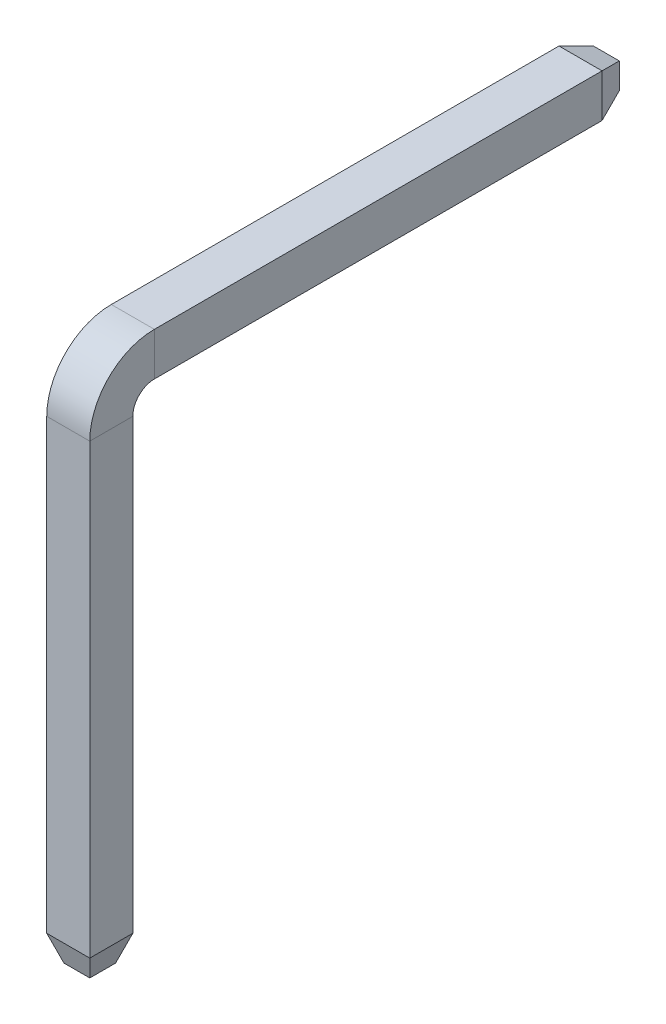
ISO-10303-21;
HEADER;
FILE_DESCRIPTION(('STEP AP214'),'2;1');
FILE_NAME('part.step','',(''),(''),'','','');
FILE_SCHEMA(('AUTOMOTIVE_DESIGN { 1 0 10303 214 1 1 1 1 }'));
ENDSEC;
DATA;
#1=APPLICATION_CONTEXT('core data for automotive mechanical design processes');
#2=APPLICATION_PROTOCOL_DEFINITION('international standard','automotive_design',2000,#1);
#3=PRODUCT_CONTEXT('',#1,'mechanical');
#4=PRODUCT('Part','Part','',(#3));
#5=PRODUCT_RELATED_PRODUCT_CATEGORY('part','',(#4));
#6=PRODUCT_DEFINITION_FORMATION('','',#4);
#7=PRODUCT_DEFINITION_CONTEXT('part definition',#1,'design');
#8=PRODUCT_DEFINITION('design','',#6,#7);
#9=PRODUCT_DEFINITION_SHAPE('','',#8);
#10=(LENGTH_UNIT() NAMED_UNIT(*) SI_UNIT(.MILLI.,.METRE.));
#11=(NAMED_UNIT(*) PLANE_ANGLE_UNIT() SI_UNIT($,.RADIAN.));
#12=(NAMED_UNIT(*) SI_UNIT($,.STERADIAN.) SOLID_ANGLE_UNIT());
#13=UNCERTAINTY_MEASURE_WITH_UNIT(LENGTH_MEASURE(1.E-05),#10,'distance_accuracy_value','');
#14=(GEOMETRIC_REPRESENTATION_CONTEXT(3) GLOBAL_UNCERTAINTY_ASSIGNED_CONTEXT((#13)) GLOBAL_UNIT_ASSIGNED_CONTEXT((#10,
#11,#12)) REPRESENTATION_CONTEXT('',''));
#15=CARTESIAN_POINT('',(0.,0.,0.));
#16=DIRECTION('',(0.,0.,1.));
#17=DIRECTION('',(1.,0.,0.));
#18=AXIS2_PLACEMENT_3D('',#15,#16,#17);
#19=CARTESIAN_POINT('',(0.,0.,0.));
#20=DIRECTION('',(0.,0.,-1.));
#21=DIRECTION('',(-1.,0.,0.));
#22=AXIS2_PLACEMENT_3D('',#19,#20,#21);
#23=PLANE('',#22);
#24=DIRECTION('',(0.,1.,0.));
#25=VECTOR('',#24,1.);
#26=CARTESIAN_POINT('',(-0.150000000000001,0.,0.));
#27=LINE('',#26,#25);
#28=CARTESIAN_POINT('',(-0.150000000000001,-0.150000000000001,0.));
#29=VERTEX_POINT('',#28);
#30=CARTESIAN_POINT('',(-0.150000000000001,0.150000000000001,0.));
#31=VERTEX_POINT('',#30);
#32=EDGE_CURVE('E236',#29,#31,#27,.T.);
#33=ORIENTED_EDGE('',*,*,#32,.T.);
#34=DIRECTION('',(1.,0.,0.));
#35=VECTOR('',#34,1.);
#36=CARTESIAN_POINT('',(0.,0.150000000000001,0.));
#37=LINE('',#36,#35);
#38=CARTESIAN_POINT('',(0.150000000000001,0.150000000000001,0.));
#39=VERTEX_POINT('',#38);
#40=EDGE_CURVE('E239',#31,#39,#37,.T.);
#41=ORIENTED_EDGE('',*,*,#40,.T.);
#42=DIRECTION('',(0.,-1.,0.));
#43=VECTOR('',#42,1.);
#44=CARTESIAN_POINT('',(0.150000000000001,0.,0.));
#45=LINE('',#44,#43);
#46=CARTESIAN_POINT('',(0.150000000000001,-0.150000000000001,0.));
#47=VERTEX_POINT('',#46);
#48=EDGE_CURVE('E230',#39,#47,#45,.T.);
#49=ORIENTED_EDGE('',*,*,#48,.T.);
#50=DIRECTION('',(-1.,0.,0.));
#51=VECTOR('',#50,1.);
#52=CARTESIAN_POINT('',(0.,-0.150000000000001,0.));
#53=LINE('',#52,#51);
#54=EDGE_CURVE('E233',#47,#29,#53,.T.);
#55=ORIENTED_EDGE('',*,*,#54,.T.);
#56=EDGE_LOOP('',(#33,#41,#49,#55));
#57=FACE_BOUND('',#56,.T.);
#58=ADVANCED_FACE('F41',(#57),#23,.T.);
#59=CARTESIAN_POINT('',(0.,-6.,6.));
#60=DIRECTION('',(0.,1.,0.));
#61=DIRECTION('',(-1.,0.,0.));
#62=AXIS2_PLACEMENT_3D('',#59,#60,#61);
#63=PLANE('',#62);
#64=DIRECTION('',(0.,0.,-1.));
#65=VECTOR('',#64,1.);
#66=CARTESIAN_POINT('',(-0.150000000000001,-6.,5.75));
#67=LINE('',#66,#65);
#68=CARTESIAN_POINT('',(-0.150000000000001,-6.,6.15));
#69=VERTEX_POINT('',#68);
#70=CARTESIAN_POINT('',(-0.150000000000001,-6.,5.85));
#71=VERTEX_POINT('',#70);
#72=EDGE_CURVE('E270',#69,#71,#67,.T.);
#73=ORIENTED_EDGE('',*,*,#72,.T.);
#74=DIRECTION('',(1.,0.,0.));
#75=VECTOR('',#74,1.);
#76=CARTESIAN_POINT('',(0.25,-6.,5.85));
#77=LINE('',#76,#75);
#78=CARTESIAN_POINT('',(0.150000000000001,-6.,5.85));
#79=VERTEX_POINT('',#78);
#80=EDGE_CURVE('E273',#71,#79,#77,.T.);
#81=ORIENTED_EDGE('',*,*,#80,.T.);
#82=DIRECTION('',(0.,0.,1.));
#83=VECTOR('',#82,1.);
#84=CARTESIAN_POINT('',(0.150000000000001,-6.,6.25));
#85=LINE('',#84,#83);
#86=CARTESIAN_POINT('',(0.150000000000001,-6.,6.15));
#87=VERTEX_POINT('',#86);
#88=EDGE_CURVE('E251',#79,#87,#85,.T.);
#89=ORIENTED_EDGE('',*,*,#88,.T.);
#90=DIRECTION('',(-1.,0.,0.));
#91=VECTOR('',#90,1.);
#92=CARTESIAN_POINT('',(-0.25,-6.,6.15));
#93=LINE('',#92,#91);
#94=EDGE_CURVE('E267',#87,#69,#93,.T.);
#95=ORIENTED_EDGE('',*,*,#94,.T.);
#96=EDGE_LOOP('',(#73,#81,#89,#95));
#97=FACE_BOUND('',#96,.T.);
#98=ADVANCED_FACE('F317',(#97),#63,.F.);
#99=CARTESIAN_POINT('',(0.25,-0.25,0.));
#100=DIRECTION('',(1.,0.,0.));
#101=DIRECTION('',(0.,0.,-1.));
#102=AXIS2_PLACEMENT_3D('',#99,#100,#101);
#103=PLANE('',#102);
#104=DIRECTION('',(0.,0.,1.));
#105=VECTOR('',#104,1.);
#106=CARTESIAN_POINT('',(0.25,-0.25,0.));
#107=LINE('',#106,#105);
#108=CARTESIAN_POINT('',(0.25,-0.25,0.300000000000002));
#109=VERTEX_POINT('',#108);
#110=CARTESIAN_POINT('',(0.25,-0.250000000000001,5.5));
#111=VERTEX_POINT('',#110);
#112=EDGE_CURVE('E133',#109,#111,#107,.T.);
#113=ORIENTED_EDGE('',*,*,#112,.F.);
#114=DIRECTION('',(0.,1.,0.));
#115=VECTOR('',#114,1.);
#116=CARTESIAN_POINT('',(0.25,-0.25,0.300000000000002));
#117=LINE('',#116,#115);
#118=CARTESIAN_POINT('',(0.25,0.25,0.300000000000002));
#119=VERTEX_POINT('',#118);
#120=EDGE_CURVE('E248',#109,#119,#117,.T.);
#121=ORIENTED_EDGE('',*,*,#120,.T.);
#122=DIRECTION('',(0.,0.,1.));
#123=VECTOR('',#122,1.);
#124=CARTESIAN_POINT('',(0.25,0.25,0.));
#125=LINE('',#124,#123);
#126=CARTESIAN_POINT('',(0.25,0.249999999999999,5.5));
#127=VERTEX_POINT('',#126);
#128=EDGE_CURVE('E171',#119,#127,#125,.T.);
#129=ORIENTED_EDGE('',*,*,#128,.T.);
#130=DIRECTION('',(0.,1.,0.));
#131=VECTOR('',#130,1.);
#132=CARTESIAN_POINT('',(0.25,-0.250000000000001,5.5));
#133=LINE('',#132,#131);
#134=EDGE_CURVE('E146',#111,#127,#133,.T.);
#135=ORIENTED_EDGE('',*,*,#134,.F.);
#136=EDGE_LOOP('',(#113,#121,#129,#135));
#137=FACE_BOUND('',#136,.T.);
#138=ADVANCED_FACE('F169',(#137),#103,.T.);
#139=CARTESIAN_POINT('',(-0.25,0.25,0.));
#140=DIRECTION('',(0.,1.,0.));
#141=DIRECTION('',(0.,0.,1.));
#142=AXIS2_PLACEMENT_3D('',#139,#140,#141);
#143=PLANE('',#142);
#144=ORIENTED_EDGE('',*,*,#128,.F.);
#145=DIRECTION('',(-1.,0.,0.));
#146=VECTOR('',#145,1.);
#147=CARTESIAN_POINT('',(-0.25,0.25,0.300000000000002));
#148=LINE('',#147,#146);
#149=CARTESIAN_POINT('',(-0.25,0.25,0.300000000000002));
#150=VERTEX_POINT('',#149);
#151=EDGE_CURVE('E222',#119,#150,#148,.T.);
#152=ORIENTED_EDGE('',*,*,#151,.T.);
#153=DIRECTION('',(0.,0.,1.));
#154=VECTOR('',#153,1.);
#155=CARTESIAN_POINT('',(-0.25,0.25,0.));
#156=LINE('',#155,#154);
#157=CARTESIAN_POINT('',(-0.25,0.249999999999999,5.5));
#158=VERTEX_POINT('',#157);
#159=EDGE_CURVE('E197',#150,#158,#156,.T.);
#160=ORIENTED_EDGE('',*,*,#159,.T.);
#161=DIRECTION('',(-1.,0.,0.));
#162=VECTOR('',#161,1.);
#163=CARTESIAN_POINT('',(-0.25,0.249999999999999,5.5));
#164=LINE('',#163,#162);
#165=EDGE_CURVE('E176',#127,#158,#164,.T.);
#166=ORIENTED_EDGE('',*,*,#165,.F.);
#167=EDGE_LOOP('',(#144,#152,#160,#166));
#168=FACE_BOUND('',#167,.T.);
#169=ADVANCED_FACE('F324',(#168),#143,.T.);
#170=CARTESIAN_POINT('',(-0.25,-0.25,0.));
#171=DIRECTION('',(-1.,0.,0.));
#172=DIRECTION('',(0.,0.,1.));
#173=AXIS2_PLACEMENT_3D('',#170,#171,#172);
#174=PLANE('',#173);
#175=ORIENTED_EDGE('',*,*,#159,.F.);
#176=DIRECTION('',(0.,-1.,0.));
#177=VECTOR('',#176,1.);
#178=CARTESIAN_POINT('',(-0.25,-0.25,0.300000000000002));
#179=LINE('',#178,#177);
#180=CARTESIAN_POINT('',(-0.25,-0.25,0.300000000000002));
#181=VERTEX_POINT('',#180);
#182=EDGE_CURVE('E243',#150,#181,#179,.T.);
#183=ORIENTED_EDGE('',*,*,#182,.T.);
#184=DIRECTION('',(0.,0.,1.));
#185=VECTOR('',#184,1.);
#186=CARTESIAN_POINT('',(-0.25,-0.25,0.));
#187=LINE('',#186,#185);
#188=CARTESIAN_POINT('',(-0.25,-0.250000000000001,5.5));
#189=VERTEX_POINT('',#188);
#190=EDGE_CURVE('E167',#181,#189,#187,.T.);
#191=ORIENTED_EDGE('',*,*,#190,.T.);
#192=DIRECTION('',(0.,-1.,0.));
#193=VECTOR('',#192,1.);
#194=CARTESIAN_POINT('',(-0.25,-0.250000000000001,5.5));
#195=LINE('',#194,#193);
#196=EDGE_CURVE('E200',#158,#189,#195,.T.);
#197=ORIENTED_EDGE('',*,*,#196,.F.);
#198=EDGE_LOOP('',(#175,#183,#191,#197));
#199=FACE_BOUND('',#198,.T.);
#200=ADVANCED_FACE('F346',(#199),#174,.T.);
#201=CARTESIAN_POINT('',(-0.25,-0.25,0.));
#202=DIRECTION('',(0.,-1.,0.));
#203=DIRECTION('',(0.,0.,-1.));
#204=AXIS2_PLACEMENT_3D('',#201,#202,#203);
#205=PLANE('',#204);
#206=ORIENTED_EDGE('',*,*,#190,.F.);
#207=DIRECTION('',(1.,0.,0.));
#208=VECTOR('',#207,1.);
#209=CARTESIAN_POINT('',(-0.25,-0.25,0.300000000000002));
#210=LINE('',#209,#208);
#211=EDGE_CURVE('E141',#181,#109,#210,.T.);
#212=ORIENTED_EDGE('',*,*,#211,.T.);
#213=ORIENTED_EDGE('',*,*,#112,.T.);
#214=DIRECTION('',(1.,0.,0.));
#215=VECTOR('',#214,1.);
#216=CARTESIAN_POINT('',(-0.25,-0.250000000000001,5.5));
#217=LINE('',#216,#215);
#218=EDGE_CURVE('E138',#189,#111,#217,.T.);
#219=ORIENTED_EDGE('',*,*,#218,.F.);
#220=EDGE_LOOP('',(#206,#212,#213,#219));
#221=FACE_BOUND('',#220,.T.);
#222=ADVANCED_FACE('F136',(#221),#205,.T.);
#223=CARTESIAN_POINT('',(0.25,-0.25,5.5));
#224=DIRECTION('',(1.,0.,0.));
#225=DIRECTION('',(0.,0.,-1.));
#226=AXIS2_PLACEMENT_3D('',#223,#224,#225);
#227=PLANE('',#226);
#228=CARTESIAN_POINT('',(0.25,-0.500000000000001,5.5));
#229=DIRECTION('',(1.,0.,0.));
#230=DIRECTION('',(0.,1.,0.));
#231=AXIS2_PLACEMENT_3D('',#228,#229,#230);
#232=CIRCLE('',#231,0.75);
#233=CARTESIAN_POINT('',(0.25,-0.500000000000005,6.25));
#234=VERTEX_POINT('',#233);
#235=EDGE_CURVE('E181',#127,#234,#232,.T.);
#236=ORIENTED_EDGE('',*,*,#235,.T.);
#237=DIRECTION('',(0.,0.,1.));
#238=VECTOR('',#237,1.);
#239=CARTESIAN_POINT('',(0.25,-0.500000000000002,5.75));
#240=LINE('',#239,#238);
#241=CARTESIAN_POINT('',(0.25,-0.500000000000002,5.75));
#242=VERTEX_POINT('',#241);
#243=EDGE_CURVE('E157',#242,#234,#240,.T.);
#244=ORIENTED_EDGE('',*,*,#243,.F.);
#245=CARTESIAN_POINT('',(0.25,-0.500000000000001,5.5));
#246=DIRECTION('',(1.,0.,0.));
#247=DIRECTION('',(0.,1.,0.));
#248=AXIS2_PLACEMENT_3D('',#245,#246,#247);
#249=CIRCLE('',#248,0.25);
#250=EDGE_CURVE('E153',#111,#242,#249,.T.);
#251=ORIENTED_EDGE('',*,*,#250,.F.);
#252=ORIENTED_EDGE('',*,*,#134,.T.);
#253=EDGE_LOOP('',(#236,#244,#251,#252));
#254=FACE_BOUND('',#253,.T.);
#255=ADVANCED_FACE('F155',(#254),#227,.T.);
#256=CARTESIAN_POINT('',(0.,-0.500000000000001,5.5));
#257=DIRECTION('',(1.,0.,0.));
#258=DIRECTION('',(0.,0.,-1.));
#259=AXIS2_PLACEMENT_3D('',#256,#257,#258);
#260=CYLINDRICAL_SURFACE('',#259,0.75);
#261=CARTESIAN_POINT('',(-0.25,-0.500000000000001,5.5));
#262=DIRECTION('',(1.,0.,0.));
#263=DIRECTION('',(0.,1.,0.));
#264=AXIS2_PLACEMENT_3D('',#261,#262,#263);
#265=CIRCLE('',#264,0.75);
#266=CARTESIAN_POINT('',(-0.25,-0.500000000000005,6.25));
#267=VERTEX_POINT('',#266);
#268=EDGE_CURVE('E204',#158,#267,#265,.T.);
#269=ORIENTED_EDGE('',*,*,#268,.T.);
#270=DIRECTION('',(-1.,0.,0.));
#271=VECTOR('',#270,1.);
#272=CARTESIAN_POINT('',(-0.25,-0.500000000000006,6.25));
#273=LINE('',#272,#271);
#274=EDGE_CURVE('E183',#234,#267,#273,.T.);
#275=ORIENTED_EDGE('',*,*,#274,.F.);
#276=ORIENTED_EDGE('',*,*,#235,.F.);
#277=ORIENTED_EDGE('',*,*,#165,.T.);
#278=EDGE_LOOP('',(#269,#275,#276,#277));
#279=FACE_BOUND('',#278,.T.);
#280=ADVANCED_FACE('F350',(#279),#260,.T.);
#281=CARTESIAN_POINT('',(-0.25,-0.25,5.5));
#282=DIRECTION('',(-1.,0.,0.));
#283=DIRECTION('',(0.,0.,1.));
#284=AXIS2_PLACEMENT_3D('',#281,#282,#283);
#285=PLANE('',#284);
#286=CARTESIAN_POINT('',(-0.25,-0.500000000000001,5.5));
#287=DIRECTION('',(1.,0.,0.));
#288=DIRECTION('',(0.,1.,0.));
#289=AXIS2_PLACEMENT_3D('',#286,#287,#288);
#290=CIRCLE('',#289,0.25);
#291=CARTESIAN_POINT('',(-0.25,-0.500000000000002,5.75));
#292=VERTEX_POINT('',#291);
#293=EDGE_CURVE('E165',#189,#292,#290,.T.);
#294=ORIENTED_EDGE('',*,*,#293,.T.);
#295=DIRECTION('',(0.,0.,-1.));
#296=VECTOR('',#295,1.);
#297=CARTESIAN_POINT('',(-0.25,-0.500000000000002,5.75));
#298=LINE('',#297,#296);
#299=EDGE_CURVE('E208',#267,#292,#298,.T.);
#300=ORIENTED_EDGE('',*,*,#299,.F.);
#301=ORIENTED_EDGE('',*,*,#268,.F.);
#302=ORIENTED_EDGE('',*,*,#196,.T.);
#303=EDGE_LOOP('',(#294,#300,#301,#302));
#304=FACE_BOUND('',#303,.T.);
#305=ADVANCED_FACE('F344',(#304),#285,.T.);
#306=CARTESIAN_POINT('',(0.,-0.500000000000001,5.5));
#307=DIRECTION('',(1.,0.,0.));
#308=DIRECTION('',(0.,0.,-1.));
#309=AXIS2_PLACEMENT_3D('',#306,#307,#308);
#310=CYLINDRICAL_SURFACE('',#309,0.25);
#311=DIRECTION('',(1.,0.,0.));
#312=VECTOR('',#311,1.);
#313=CARTESIAN_POINT('',(-0.25,-0.500000000000002,5.75));
#314=LINE('',#313,#312);
#315=EDGE_CURVE('E193',#292,#242,#314,.T.);
#316=ORIENTED_EDGE('',*,*,#315,.F.);
#317=ORIENTED_EDGE('',*,*,#293,.F.);
#318=ORIENTED_EDGE('',*,*,#218,.T.);
#319=ORIENTED_EDGE('',*,*,#250,.T.);
#320=EDGE_LOOP('',(#316,#317,#318,#319));
#321=FACE_BOUND('',#320,.T.);
#322=ADVANCED_FACE('F163',(#321),#310,.F.);
#323=CARTESIAN_POINT('',(0.25,-0.500000000000004,5.75));
#324=DIRECTION('',(1.,0.,0.));
#325=DIRECTION('',(0.,0.,-1.));
#326=AXIS2_PLACEMENT_3D('',#323,#324,#325);
#327=PLANE('',#326);
#328=DIRECTION('',(0.,-1.,0.));
#329=VECTOR('',#328,1.);
#330=CARTESIAN_POINT('',(0.25,-0.500000000000004,6.25));
#331=LINE('',#330,#329);
#332=CARTESIAN_POINT('',(0.25,-5.7,6.25));
#333=VERTEX_POINT('',#332);
#334=EDGE_CURVE('E185',#234,#333,#331,.T.);
#335=ORIENTED_EDGE('',*,*,#334,.T.);
#336=DIRECTION('',(0.,0.,-1.));
#337=VECTOR('',#336,1.);
#338=CARTESIAN_POINT('',(0.25,-5.7,5.75));
#339=LINE('',#338,#337);
#340=CARTESIAN_POINT('',(0.25,-5.7,5.75));
#341=VERTEX_POINT('',#340);
#342=EDGE_CURVE('E11',#333,#341,#339,.T.);
#343=ORIENTED_EDGE('',*,*,#342,.T.);
#344=DIRECTION('',(0.,-1.,0.));
#345=VECTOR('',#344,1.);
#346=CARTESIAN_POINT('',(0.25,-0.500000000000004,5.75));
#347=LINE('',#346,#345);
#348=EDGE_CURVE('E189',#242,#341,#347,.T.);
#349=ORIENTED_EDGE('',*,*,#348,.F.);
#350=ORIENTED_EDGE('',*,*,#243,.T.);
#351=EDGE_LOOP('',(#335,#343,#349,#350));
#352=FACE_BOUND('',#351,.T.);
#353=ADVANCED_FACE('F309',(#352),#327,.T.);
#354=CARTESIAN_POINT('',(-0.25,-0.500000000000004,6.25));
#355=DIRECTION('',(0.,0.,1.));
#356=DIRECTION('',(0.,-1.,0.));
#357=AXIS2_PLACEMENT_3D('',#354,#355,#356);
#358=PLANE('',#357);
#359=DIRECTION('',(0.,-1.,0.));
#360=VECTOR('',#359,1.);
#361=CARTESIAN_POINT('',(-0.25,-0.500000000000004,6.25));
#362=LINE('',#361,#360);
#363=CARTESIAN_POINT('',(-0.25,-5.7,6.25));
#364=VERTEX_POINT('',#363);
#365=EDGE_CURVE('E188',#267,#364,#362,.T.);
#366=ORIENTED_EDGE('',*,*,#365,.T.);
#367=DIRECTION('',(1.,0.,0.));
#368=VECTOR('',#367,1.);
#369=CARTESIAN_POINT('',(0.25,-5.7,6.25));
#370=LINE('',#369,#368);
#371=EDGE_CURVE('E52',#364,#333,#370,.T.);
#372=ORIENTED_EDGE('',*,*,#371,.T.);
#373=ORIENTED_EDGE('',*,*,#334,.F.);
#374=ORIENTED_EDGE('',*,*,#274,.T.);
#375=EDGE_LOOP('',(#366,#372,#373,#374));
#376=FACE_BOUND('',#375,.T.);
#377=ADVANCED_FACE('F339',(#376),#358,.T.);
#378=CARTESIAN_POINT('',(-0.25,-0.500000000000004,5.75));
#379=DIRECTION('',(-1.,0.,0.));
#380=DIRECTION('',(0.,0.,1.));
#381=AXIS2_PLACEMENT_3D('',#378,#379,#380);
#382=PLANE('',#381);
#383=DIRECTION('',(0.,-1.,0.));
#384=VECTOR('',#383,1.);
#385=CARTESIAN_POINT('',(-0.25,-0.500000000000004,5.75));
#386=LINE('',#385,#384);
#387=CARTESIAN_POINT('',(-0.25,-5.7,5.75));
#388=VERTEX_POINT('',#387);
#389=EDGE_CURVE('E211',#292,#388,#386,.T.);
#390=ORIENTED_EDGE('',*,*,#389,.T.);
#391=DIRECTION('',(0.,0.,1.));
#392=VECTOR('',#391,1.);
#393=CARTESIAN_POINT('',(-0.25,-5.7,6.25));
#394=LINE('',#393,#392);
#395=EDGE_CURVE('E67',#388,#364,#394,.T.);
#396=ORIENTED_EDGE('',*,*,#395,.T.);
#397=ORIENTED_EDGE('',*,*,#365,.F.);
#398=ORIENTED_EDGE('',*,*,#299,.T.);
#399=EDGE_LOOP('',(#390,#396,#397,#398));
#400=FACE_BOUND('',#399,.T.);
#401=ADVANCED_FACE('F331',(#400),#382,.T.);
#402=CARTESIAN_POINT('',(-0.25,-0.500000000000004,5.75));
#403=DIRECTION('',(0.,0.,-1.));
#404=DIRECTION('',(0.,1.,0.));
#405=AXIS2_PLACEMENT_3D('',#402,#403,#404);
#406=PLANE('',#405);
#407=ORIENTED_EDGE('',*,*,#348,.T.);
#408=DIRECTION('',(-1.,0.,0.));
#409=VECTOR('',#408,1.);
#410=CARTESIAN_POINT('',(-0.25,-5.7,5.75));
#411=LINE('',#410,#409);
#412=EDGE_CURVE('E277',#341,#388,#411,.T.);
#413=ORIENTED_EDGE('',*,*,#412,.T.);
#414=ORIENTED_EDGE('',*,*,#389,.F.);
#415=ORIENTED_EDGE('',*,*,#315,.T.);
#416=EDGE_LOOP('',(#407,#413,#414,#415));
#417=FACE_BOUND('',#416,.T.);
#418=ADVANCED_FACE('F312',(#417),#406,.T.);
#419=CARTESIAN_POINT('',(-0.25,-0.25,0.300000000000002));
#420=DIRECTION('',(0.,0.948683298050515,0.316227766016835));
#421=DIRECTION('',(1.,0.,0.));
#422=AXIS2_PLACEMENT_3D('',#419,#420,#421);
#423=PLANE('',#422);
#424=DIRECTION('',(0.301511344577761,0.301511344577761,-0.904534033733293));
#425=VECTOR('',#424,1.);
#426=CARTESIAN_POINT('',(-0.25,-0.25,0.300000000000002));
#427=LINE('',#426,#425);
#428=EDGE_CURVE('E258',#29,#181,#427,.F.);
#429=ORIENTED_EDGE('',*,*,#428,.F.);
#430=ORIENTED_EDGE('',*,*,#54,.F.);
#431=DIRECTION('',(-0.301511344577761,0.301511344577761,-0.904534033733293));
#432=VECTOR('',#431,1.);
#433=CARTESIAN_POINT('',(0.25,-0.25,0.300000000000002));
#434=LINE('',#433,#432);
#435=EDGE_CURVE('E147',#109,#47,#434,.T.);
#436=ORIENTED_EDGE('',*,*,#435,.F.);
#437=ORIENTED_EDGE('',*,*,#211,.F.);
#438=EDGE_LOOP('',(#429,#430,#436,#437));
#439=FACE_BOUND('',#438,.T.);
#440=ADVANCED_FACE('F328',(#439),#423,.F.);
#441=CARTESIAN_POINT('',(0.25,-0.25,0.300000000000002));
#442=DIRECTION('',(-0.948683298050515,0.,0.316227766016835));
#443=DIRECTION('',(0.,1.,0.));
#444=AXIS2_PLACEMENT_3D('',#441,#442,#443);
#445=PLANE('',#444);
#446=ORIENTED_EDGE('',*,*,#435,.T.);
#447=ORIENTED_EDGE('',*,*,#48,.F.);
#448=DIRECTION('',(0.301511344577761,0.301511344577761,0.904534033733293));
#449=VECTOR('',#448,1.);
#450=CARTESIAN_POINT('',(0.204545454545455,0.204545454545455,0.163636363636366));
#451=LINE('',#450,#449);
#452=EDGE_CURVE('E255',#119,#39,#451,.F.);
#453=ORIENTED_EDGE('',*,*,#452,.F.);
#454=ORIENTED_EDGE('',*,*,#120,.F.);
#455=EDGE_LOOP('',(#446,#447,#453,#454));
#456=FACE_BOUND('',#455,.T.);
#457=ADVANCED_FACE('F336',(#456),#445,.F.);
#458=CARTESIAN_POINT('',(-0.25,-0.25,0.300000000000002));
#459=DIRECTION('',(0.948683298050515,0.,0.316227766016835));
#460=DIRECTION('',(0.,-1.,0.));
#461=AXIS2_PLACEMENT_3D('',#458,#459,#460);
#462=PLANE('',#461);
#463=ORIENTED_EDGE('',*,*,#428,.T.);
#464=ORIENTED_EDGE('',*,*,#182,.F.);
#465=DIRECTION('',(0.301511344577761,-0.301511344577761,-0.904534033733293));
#466=VECTOR('',#465,1.);
#467=CARTESIAN_POINT('',(-0.204545454545455,0.204545454545455,0.163636363636366));
#468=LINE('',#467,#466);
#469=EDGE_CURVE('E252',#31,#150,#468,.F.);
#470=ORIENTED_EDGE('',*,*,#469,.F.);
#471=ORIENTED_EDGE('',*,*,#32,.F.);
#472=EDGE_LOOP('',(#463,#464,#470,#471));
#473=FACE_BOUND('',#472,.T.);
#474=ADVANCED_FACE('F459',(#473),#462,.F.);
#475=CARTESIAN_POINT('',(-0.25,0.25,0.300000000000002));
#476=DIRECTION('',(0.,-0.948683298050515,0.316227766016835));
#477=DIRECTION('',(-1.,0.,0.));
#478=AXIS2_PLACEMENT_3D('',#475,#476,#477);
#479=PLANE('',#478);
#480=ORIENTED_EDGE('',*,*,#452,.T.);
#481=ORIENTED_EDGE('',*,*,#40,.F.);
#482=ORIENTED_EDGE('',*,*,#469,.T.);
#483=ORIENTED_EDGE('',*,*,#151,.F.);
#484=EDGE_LOOP('',(#480,#481,#482,#483));
#485=FACE_BOUND('',#484,.T.);
#486=ADVANCED_FACE('F409',(#485),#479,.F.);
#487=CARTESIAN_POINT('',(0.,-6.,6.15));
#488=DIRECTION('',(0.,-0.316227766016835,0.948683298050515));
#489=DIRECTION('',(1.,0.,0.));
#490=AXIS2_PLACEMENT_3D('',#487,#488,#489);
#491=PLANE('',#490);
#492=DIRECTION('',(-0.301511344577761,-0.904534033733293,-0.301511344577761));
#493=VECTOR('',#492,1.);
#494=CARTESIAN_POINT('',(0.136363636363637,-6.04090909090909,6.13636363636364));
#495=LINE('',#494,#493);
#496=EDGE_CURVE('E290',#333,#87,#495,.T.);
#497=ORIENTED_EDGE('',*,*,#496,.F.);
#498=ORIENTED_EDGE('',*,*,#371,.F.);
#499=DIRECTION('',(0.301511344577761,-0.904534033733293,-0.301511344577761));
#500=VECTOR('',#499,1.);
#501=CARTESIAN_POINT('',(-0.136363636363637,-6.04090909090909,6.13636363636364));
#502=LINE('',#501,#500);
#503=EDGE_CURVE('E46',#69,#364,#502,.F.);
#504=ORIENTED_EDGE('',*,*,#503,.F.);
#505=ORIENTED_EDGE('',*,*,#94,.F.);
#506=EDGE_LOOP('',(#497,#498,#504,#505));
#507=FACE_BOUND('',#506,.T.);
#508=ADVANCED_FACE('F44',(#507),#491,.T.);
#509=CARTESIAN_POINT('',(-0.150000000000001,-6.,6.));
#510=DIRECTION('',(-0.948683298050515,-0.316227766016835,0.));
#511=DIRECTION('',(0.,0.,1.));
#512=AXIS2_PLACEMENT_3D('',#509,#510,#511);
#513=PLANE('',#512);
#514=ORIENTED_EDGE('',*,*,#503,.T.);
#515=ORIENTED_EDGE('',*,*,#395,.F.);
#516=DIRECTION('',(0.301511344577761,-0.904534033733293,0.301511344577761));
#517=VECTOR('',#516,1.);
#518=CARTESIAN_POINT('',(-0.136363636363637,-6.04090909090909,5.86363636363636));
#519=LINE('',#518,#517);
#520=EDGE_CURVE('E288',#71,#388,#519,.F.);
#521=ORIENTED_EDGE('',*,*,#520,.F.);
#522=ORIENTED_EDGE('',*,*,#72,.F.);
#523=EDGE_LOOP('',(#514,#515,#521,#522));
#524=FACE_BOUND('',#523,.T.);
#525=ADVANCED_FACE('F302',(#524),#513,.T.);
#526=CARTESIAN_POINT('',(0.150000000000001,-6.,6.));
#527=DIRECTION('',(0.948683298050515,-0.316227766016835,0.));
#528=DIRECTION('',(0.,0.,-1.));
#529=AXIS2_PLACEMENT_3D('',#526,#527,#528);
#530=PLANE('',#529);
#531=ORIENTED_EDGE('',*,*,#496,.T.);
#532=ORIENTED_EDGE('',*,*,#88,.F.);
#533=DIRECTION('',(0.301511344577761,0.904534033733293,-0.301511344577761));
#534=VECTOR('',#533,1.);
#535=CARTESIAN_POINT('',(0.136363636363637,-6.04090909090909,5.86363636363636));
#536=LINE('',#535,#534);
#537=EDGE_CURVE('E285',#341,#79,#536,.F.);
#538=ORIENTED_EDGE('',*,*,#537,.F.);
#539=ORIENTED_EDGE('',*,*,#342,.F.);
#540=EDGE_LOOP('',(#531,#532,#538,#539));
#541=FACE_BOUND('',#540,.T.);
#542=ADVANCED_FACE('F307',(#541),#530,.T.);
#543=CARTESIAN_POINT('',(0.,-6.,5.85));
#544=DIRECTION('',(0.,-0.316227766016835,-0.948683298050515));
#545=DIRECTION('',(-1.,0.,0.));
#546=AXIS2_PLACEMENT_3D('',#543,#544,#545);
#547=PLANE('',#546);
#548=ORIENTED_EDGE('',*,*,#520,.T.);
#549=ORIENTED_EDGE('',*,*,#412,.F.);
#550=ORIENTED_EDGE('',*,*,#537,.T.);
#551=ORIENTED_EDGE('',*,*,#80,.F.);
#552=EDGE_LOOP('',(#548,#549,#550,#551));
#553=FACE_BOUND('',#552,.T.);
#554=ADVANCED_FACE('F314',(#553),#547,.T.);
#555=CLOSED_SHELL('',(#58,#98,#138,#169,#200,#222,#255,#280,#305,#322,#353,#377,#401,#418,#440,
#457,#474,#486,#508,#525,#542,#554));
#556=MANIFOLD_SOLID_BREP('B2',#555);
#557=ADVANCED_BREP_SHAPE_REPRESENTATION('',(#18,#556),#14);
#558=SHAPE_DEFINITION_REPRESENTATION(#9,#557);
ENDSEC;
END-ISO-10303-21;
